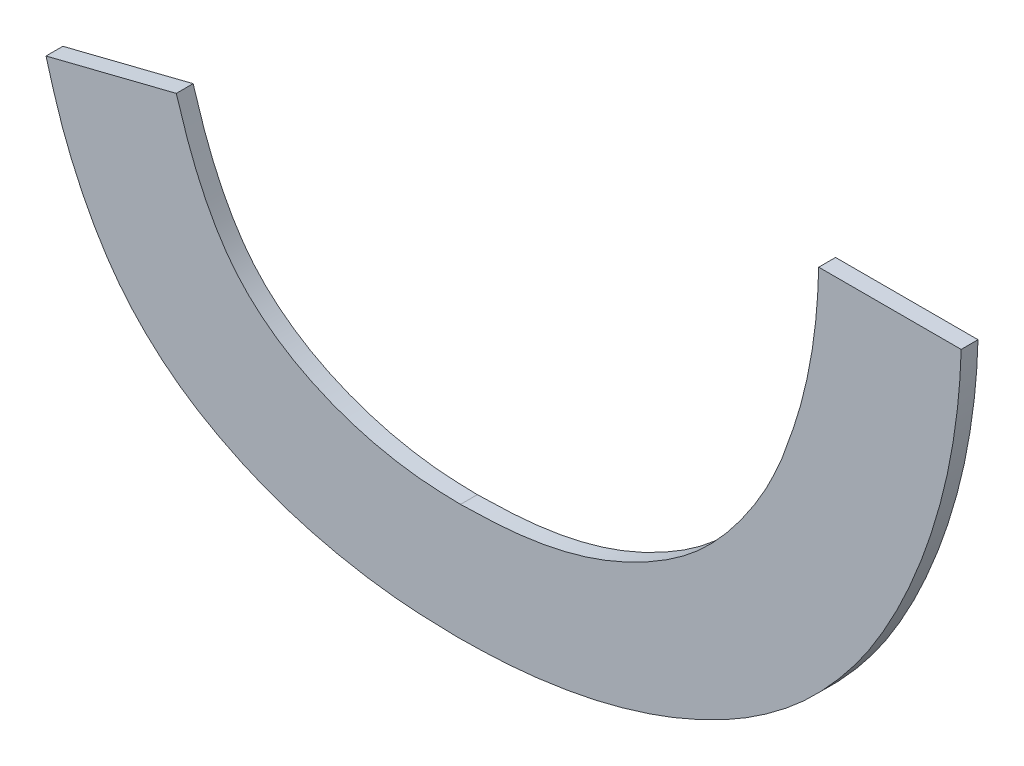
ISO-10303-21;
HEADER;
FILE_DESCRIPTION(('STEP AP214'),'2;1');
FILE_NAME('part.step','',(''),(''),'','','');
FILE_SCHEMA(('AUTOMOTIVE_DESIGN { 1 0 10303 214 1 1 1 1 }'));
ENDSEC;
DATA;
#1=APPLICATION_CONTEXT('core data for automotive mechanical design processes');
#2=APPLICATION_PROTOCOL_DEFINITION('international standard','automotive_design',2000,#1);
#3=PRODUCT_CONTEXT('',#1,'mechanical');
#4=PRODUCT('Part','Part','',(#3));
#5=PRODUCT_RELATED_PRODUCT_CATEGORY('part','',(#4));
#6=PRODUCT_DEFINITION_FORMATION('','',#4);
#7=PRODUCT_DEFINITION_CONTEXT('part definition',#1,'design');
#8=PRODUCT_DEFINITION('design','',#6,#7);
#9=PRODUCT_DEFINITION_SHAPE('','',#8);
#10=(LENGTH_UNIT() NAMED_UNIT(*) SI_UNIT(.MILLI.,.METRE.));
#11=(NAMED_UNIT(*) PLANE_ANGLE_UNIT() SI_UNIT($,.RADIAN.));
#12=(NAMED_UNIT(*) SI_UNIT($,.STERADIAN.) SOLID_ANGLE_UNIT());
#13=UNCERTAINTY_MEASURE_WITH_UNIT(LENGTH_MEASURE(1.E-05),#10,'distance_accuracy_value','');
#14=(GEOMETRIC_REPRESENTATION_CONTEXT(3) GLOBAL_UNCERTAINTY_ASSIGNED_CONTEXT((#13)) GLOBAL_UNIT_ASSIGNED_CONTEXT((#10,
#11,#12)) REPRESENTATION_CONTEXT('',''));
#15=CARTESIAN_POINT('',(0.,0.,0.));
#16=DIRECTION('',(0.,0.,1.));
#17=DIRECTION('',(1.,0.,0.));
#18=AXIS2_PLACEMENT_3D('',#15,#16,#17);
#19=CARTESIAN_POINT('',(-0.655048076924108,-11.9230769230769,0.5));
#20=CARTESIAN_POINT('',(-0.227942676023708,-11.912253221892,0.5));
#21=CARTESIAN_POINT('',(0.598985768411185,-11.8912972087745,0.5));
#22=CARTESIAN_POINT('',(1.79560321634429,-11.7428681340874,0.5));
#23=CARTESIAN_POINT('',(2.90208486743284,-11.4859858211931,0.5));
#24=CARTESIAN_POINT('',(3.91633813217372,-11.1241287640719,0.5));
#25=CARTESIAN_POINT('',(4.83588007622652,-10.6758590976377,0.5));
#26=CARTESIAN_POINT('',(5.67194288654616,-10.1735783047434,0.5));
#27=CARTESIAN_POINT('',(6.41263796404371,-9.60066620440625,0.5));
#28=CARTESIAN_POINT('',(7.05050920546266,-8.95610176625778,0.5));
#29=CARTESIAN_POINT('',(7.60994307134322,-8.26736469873984,0.5));
#30=CARTESIAN_POINT('',(8.10246708340465,-7.54470611909437,0.5));
#31=CARTESIAN_POINT('',(8.53640603782529,-6.79136395118303,0.5));
#32=CARTESIAN_POINT('',(8.76685496092209,-6.2623875938111,0.5));
#33=CARTESIAN_POINT('',(8.88221153846051,-5.99759615384615,0.5));
#34=B_SPLINE_CURVE_WITH_KNOTS('',3,(#19,#20,#21,#22,#23,#24,#25,#26,#27,#28,#29,#30,#31,#32,
#33),.UNSPECIFIED.,.F.,.F.,(4,1,1,1,1,1,1,1,1,1,1,1,4),(0.,0.106836014180273,0.206847627844255,
0.301052142516832,0.390450206998593,0.475620260337238,0.556580351208598,0.634067813729026,
0.709190584265669,0.782918087754289,0.855752867743289,0.927793737227064,1.),.UNSPECIFIED.);
#35=DIRECTION('',(0.,0.,1.));
#36=VECTOR('',#35,1.);
#37=SURFACE_OF_LINEAR_EXTRUSION('',#34,#36);
#38=CARTESIAN_POINT('',(-0.655048076924108,-11.9230769230769,1.));
#39=CARTESIAN_POINT('',(-0.227942676023708,-11.912253221892,1.));
#40=CARTESIAN_POINT('',(0.598985768411185,-11.8912972087745,1.));
#41=CARTESIAN_POINT('',(1.79560321634429,-11.7428681340874,1.));
#42=CARTESIAN_POINT('',(2.90208486743284,-11.4859858211931,1.));
#43=CARTESIAN_POINT('',(3.91633813217372,-11.1241287640719,1.));
#44=CARTESIAN_POINT('',(4.83588007622652,-10.6758590976377,1.));
#45=CARTESIAN_POINT('',(5.67194288654616,-10.1735783047434,1.));
#46=CARTESIAN_POINT('',(6.41263796404371,-9.60066620440625,1.));
#47=CARTESIAN_POINT('',(7.05050920546266,-8.95610176625778,1.));
#48=CARTESIAN_POINT('',(7.60994307134322,-8.26736469873984,1.));
#49=CARTESIAN_POINT('',(8.10246708340465,-7.54470611909437,1.));
#50=CARTESIAN_POINT('',(8.53640603782529,-6.79136395118303,1.));
#51=CARTESIAN_POINT('',(8.76685496092209,-6.2623875938111,1.));
#52=CARTESIAN_POINT('',(8.88221153846051,-5.99759615384615,1.));
#53=B_SPLINE_CURVE_WITH_KNOTS('',3,(#38,#39,#40,#41,#42,#43,#44,#45,#46,#47,#48,#49,#50,#51,
#52),.UNSPECIFIED.,.F.,.F.,(4,1,1,1,1,1,1,1,1,1,1,1,4),(0.,0.106836014180273,0.206847627844255,
0.301052142516832,0.390450206998593,0.475620260337238,0.556580351208598,0.634067813729026,
0.709190584265669,0.782918087754289,0.855752867743289,0.927793737227064,1.),.UNSPECIFIED.);
#54=CARTESIAN_POINT('',(-0.655048076924108,-11.9230769230769,1.));
#55=VERTEX_POINT('',#54);
#56=CARTESIAN_POINT('',(8.88221153846051,-5.99759615384615,1.));
#57=VERTEX_POINT('',#56);
#58=EDGE_CURVE('E87',#55,#57,#53,.T.);
#59=ORIENTED_EDGE('',*,*,#58,.T.);
#60=DIRECTION('',(0.,0.,1.));
#61=VECTOR('',#60,1.);
#62=CARTESIAN_POINT('',(8.88221153846051,-5.99759615384615,0.5));
#63=LINE('',#62,#61);
#64=CARTESIAN_POINT('',(8.88221153846051,-5.99759615384615,0.5));
#65=VERTEX_POINT('',#64);
#66=EDGE_CURVE('E177',#65,#57,#63,.T.);
#67=ORIENTED_EDGE('',*,*,#66,.F.);
#68=CARTESIAN_POINT('',(-0.655048076924108,-11.9230769230769,0.5));
#69=VERTEX_POINT('',#68);
#70=EDGE_CURVE('E63',#69,#65,#34,.T.);
#71=ORIENTED_EDGE('',*,*,#70,.F.);
#72=DIRECTION('',(0.,0.,1.));
#73=VECTOR('',#72,1.);
#74=CARTESIAN_POINT('',(-0.655048076924108,-11.9230769230769,0.5));
#75=LINE('',#74,#73);
#76=EDGE_CURVE('E121',#69,#55,#75,.T.);
#77=ORIENTED_EDGE('',*,*,#76,.T.);
#78=EDGE_LOOP('',(#59,#67,#71,#77));
#79=FACE_BOUND('',#78,.T.);
#80=ADVANCED_FACE('F39',(#79),#37,.F.);
#81=CARTESIAN_POINT('',(-9.09855769230872,-5.57091346153846,0.5));
#82=CARTESIAN_POINT('',(-8.98744101230085,-5.92721490390044,0.5));
#83=CARTESIAN_POINT('',(-8.77518048125361,-6.6078393912707,0.5));
#84=CARTESIAN_POINT('',(-8.3913070395867,-7.55641994943278,0.5));
#85=CARTESIAN_POINT('',(-7.96614306189073,-8.38541793645205,0.5));
#86=CARTESIAN_POINT('',(-7.49288630827849,-9.10846318948869,0.5));
#87=CARTESIAN_POINT('',(-6.93469335671508,-9.73466221352528,0.5));
#88=CARTESIAN_POINT('',(-6.28029615159374,-10.2803240013245,0.5));
#89=CARTESIAN_POINT('',(-5.52615107295613,-10.766113790124,0.5));
#90=CARTESIAN_POINT('',(-4.67479891142124,-11.1738680004581,0.5));
#91=CARTESIAN_POINT('',(-3.74774547887376,-11.5108745720782,0.5));
#92=CARTESIAN_POINT('',(-2.75985926458209,-11.7476719126669,0.5));
#93=CARTESIAN_POINT('',(-1.7233230579297,-11.8973046334385,0.5));
#94=CARTESIAN_POINT('',(-1.0161512438861,-11.9143652565362,0.5));
#95=CARTESIAN_POINT('',(-0.655048076924108,-11.9230769230769,0.5));
#96=B_SPLINE_CURVE_WITH_KNOTS('',3,(#81,#82,#83,#84,#85,#86,#87,#88,#89,#90,#91,#92,#93,#94,
#95),.UNSPECIFIED.,.F.,.F.,(4,1,1,1,1,1,1,1,1,1,1,1,4),(0.,0.0970539780290819,0.185397268126071,
0.265800241660235,0.339070664187919,0.40956103956954,0.483149451900637,0.560041506691692,
0.642305539556533,0.728180250965224,0.816140077428627,0.906115601612743,1.),.UNSPECIFIED.);
#97=DIRECTION('',(0.,0.,1.));
#98=VECTOR('',#97,1.);
#99=SURFACE_OF_LINEAR_EXTRUSION('',#96,#98);
#100=CARTESIAN_POINT('',(-9.09855769230872,-5.57091346153846,1.));
#101=CARTESIAN_POINT('',(-8.98744101230085,-5.92721490390044,1.));
#102=CARTESIAN_POINT('',(-8.77518048125361,-6.6078393912707,1.));
#103=CARTESIAN_POINT('',(-8.3913070395867,-7.55641994943278,1.));
#104=CARTESIAN_POINT('',(-7.96614306189073,-8.38541793645205,1.));
#105=CARTESIAN_POINT('',(-7.49288630827849,-9.10846318948869,1.));
#106=CARTESIAN_POINT('',(-6.93469335671508,-9.73466221352528,1.));
#107=CARTESIAN_POINT('',(-6.28029615159374,-10.2803240013245,1.));
#108=CARTESIAN_POINT('',(-5.52615107295613,-10.766113790124,1.));
#109=CARTESIAN_POINT('',(-4.67479891142124,-11.1738680004581,1.));
#110=CARTESIAN_POINT('',(-3.74774547887376,-11.5108745720782,1.));
#111=CARTESIAN_POINT('',(-2.75985926458209,-11.7476719126669,1.));
#112=CARTESIAN_POINT('',(-1.7233230579297,-11.8973046334385,1.));
#113=CARTESIAN_POINT('',(-1.0161512438861,-11.9143652565362,1.));
#114=CARTESIAN_POINT('',(-0.655048076924108,-11.9230769230769,1.));
#115=B_SPLINE_CURVE_WITH_KNOTS('',3,(#100,#101,#102,#103,#104,#105,#106,#107,#108,#109,#110,
#111,#112,#113,#114),.UNSPECIFIED.,.F.,.F.,(4,1,1,1,1,1,1,1,1,1,1,1,4),(0.,0.0970539780290819,
0.185397268126071,0.265800241660235,0.339070664187919,0.40956103956954,0.483149451900637,
0.560041506691692,0.642305539556533,0.728180250965224,0.816140077428627,0.906115601612743,1.),.UNSPECIFIED.);
#116=CARTESIAN_POINT('',(-9.09855769230872,-5.57091346153846,1.));
#117=VERTEX_POINT('',#116);
#118=EDGE_CURVE('E192',#117,#55,#115,.T.);
#119=ORIENTED_EDGE('',*,*,#118,.T.);
#120=ORIENTED_EDGE('',*,*,#76,.F.);
#121=CARTESIAN_POINT('',(-9.09855769230872,-5.57091346153846,0.5));
#122=VERTEX_POINT('',#121);
#123=EDGE_CURVE('E109',#122,#69,#96,.T.);
#124=ORIENTED_EDGE('',*,*,#123,.F.);
#125=DIRECTION('',(0.,0.,1.));
#126=VECTOR('',#125,1.);
#127=CARTESIAN_POINT('',(-9.09855769230872,-5.57091346153846,0.5));
#128=LINE('',#127,#126);
#129=EDGE_CURVE('E117',#122,#117,#128,.T.);
#130=ORIENTED_EDGE('',*,*,#129,.T.);
#131=EDGE_LOOP('',(#119,#120,#124,#130));
#132=FACE_BOUND('',#131,.T.);
#133=ADVANCED_FACE('F124',(#132),#99,.F.);
#134=CARTESIAN_POINT('',(-12.968750000001,-6.54447115384615,0.5));
#135=DIRECTION('',(0.243952665653616,-0.969787140005731,0.));
#136=DIRECTION('',(0.969787140005731,0.243952665653616,0.));
#137=AXIS2_PLACEMENT_3D('',#134,#135,#136);
#138=PLANE('',#137);
#139=DIRECTION('',(0.969787140005731,0.243952665653616,0.));
#140=VECTOR('',#139,1.);
#141=CARTESIAN_POINT('',(-12.968750000001,-6.54447115384615,1.));
#142=LINE('',#141,#140);
#143=CARTESIAN_POINT('',(-12.968750000001,-6.54447115384615,1.));
#144=VERTEX_POINT('',#143);
#145=EDGE_CURVE('E116',#144,#117,#142,.T.);
#146=ORIENTED_EDGE('',*,*,#145,.T.);
#147=ORIENTED_EDGE('',*,*,#129,.F.);
#148=DIRECTION('',(0.969787140005731,0.243952665653616,0.));
#149=VECTOR('',#148,1.);
#150=CARTESIAN_POINT('',(-12.968750000001,-6.54447115384615,0.5));
#151=LINE('',#150,#149);
#152=CARTESIAN_POINT('',(-12.968750000001,-6.54447115384615,0.5));
#153=VERTEX_POINT('',#152);
#154=EDGE_CURVE('E104',#153,#122,#151,.T.);
#155=ORIENTED_EDGE('',*,*,#154,.F.);
#156=DIRECTION('',(0.,0.,1.));
#157=VECTOR('',#156,1.);
#158=CARTESIAN_POINT('',(-12.968750000001,-6.54447115384615,0.5));
#159=LINE('',#158,#157);
#160=EDGE_CURVE('E122',#153,#144,#159,.T.);
#161=ORIENTED_EDGE('',*,*,#160,.T.);
#162=EDGE_LOOP('',(#146,#147,#155,#161));
#163=FACE_BOUND('',#162,.T.);
#164=ADVANCED_FACE('F119',(#163),#138,.F.);
#165=CARTESIAN_POINT('',(-0.733173076924106,-15.3846153846154,0.5));
#166=CARTESIAN_POINT('',(-1.26067625274901,-15.3725300728332,0.5));
#167=CARTESIAN_POINT('',(-2.29550287460362,-15.3488217750659,0.5));
#168=CARTESIAN_POINT('',(-3.80623043094523,-15.1450042682463,0.5));
#169=CARTESIAN_POINT('',(-5.24201812286606,-14.8225142352632,0.5));
#170=CARTESIAN_POINT('',(-6.58941721465151,-14.3710083027541,0.5));
#171=CARTESIAN_POINT('',(-7.82481036582091,-13.7946837668456,0.499999999999999));
#172=CARTESIAN_POINT('',(-8.93869762871373,-13.124498805989,0.5));
#173=CARTESIAN_POINT('',(-9.90320600541956,-12.3348536797799,0.5));
#174=CARTESIAN_POINT('',(-10.7381426032373,-11.4373758837522,0.5));
#175=CARTESIAN_POINT('',(-11.4395655318896,-10.4063695823777,0.5));
#176=CARTESIAN_POINT('',(-12.0462185256259,-9.24722003974045,0.5));
#177=CARTESIAN_POINT('',(-12.5723864402983,-7.95142071643278,0.5));
#178=CARTESIAN_POINT('',(-12.8336000795706,-7.02420526859636,0.5));
#179=CARTESIAN_POINT('',(-12.968750000001,-6.54447115384615,0.5));
#180=B_SPLINE_CURVE_WITH_KNOTS('',3,(#165,#166,#167,#168,#169,#170,#171,#172,#173,#174,#175,
#176,#177,#178,#179),.UNSPECIFIED.,.F.,.F.,(4,1,1,1,1,1,1,1,1,1,1,1,4),(0.,0.0958865091492192,
0.188104862476228,0.276649211064151,0.363159075085236,0.445946771508884,0.524101789397687,
0.598915408299288,0.671864768558401,0.746232765202449,0.824936792244247,0.909423647768157,1.),.UNSPECIFIED.);
#181=DIRECTION('',(0.,0.,1.));
#182=VECTOR('',#181,1.);
#183=SURFACE_OF_LINEAR_EXTRUSION('',#180,#182);
#184=CARTESIAN_POINT('',(-0.733173076924106,-15.3846153846154,1.));
#185=CARTESIAN_POINT('',(-1.26067625274901,-15.3725300728332,1.));
#186=CARTESIAN_POINT('',(-2.29550287460362,-15.3488217750659,1.));
#187=CARTESIAN_POINT('',(-3.80623043094523,-15.1450042682463,1.));
#188=CARTESIAN_POINT('',(-5.24201812286606,-14.8225142352632,1.));
#189=CARTESIAN_POINT('',(-6.58941721465151,-14.3710083027541,1.));
#190=CARTESIAN_POINT('',(-7.82481036582091,-13.7946837668456,0.999999999999999));
#191=CARTESIAN_POINT('',(-8.93869762871373,-13.124498805989,1.));
#192=CARTESIAN_POINT('',(-9.90320600541956,-12.3348536797799,1.));
#193=CARTESIAN_POINT('',(-10.7381426032373,-11.4373758837522,1.));
#194=CARTESIAN_POINT('',(-11.4395655318896,-10.4063695823777,1.));
#195=CARTESIAN_POINT('',(-12.0462185256259,-9.24722003974045,1.));
#196=CARTESIAN_POINT('',(-12.5723864402983,-7.95142071643278,1.));
#197=CARTESIAN_POINT('',(-12.8336000795706,-7.02420526859636,1.));
#198=CARTESIAN_POINT('',(-12.968750000001,-6.54447115384615,1.));
#199=B_SPLINE_CURVE_WITH_KNOTS('',3,(#184,#185,#186,#187,#188,#189,#190,#191,#192,#193,#194,
#195,#196,#197,#198),.UNSPECIFIED.,.F.,.F.,(4,1,1,1,1,1,1,1,1,1,1,1,4),(0.,0.0958865091492192,
0.188104862476228,0.276649211064151,0.363159075085236,0.445946771508884,0.524101789397687,
0.598915408299288,0.671864768558401,0.746232765202449,0.824936792244247,0.909423647768157,1.),.UNSPECIFIED.);
#200=CARTESIAN_POINT('',(-0.733173076924106,-15.3846153846154,1.));
#201=VERTEX_POINT('',#200);
#202=EDGE_CURVE('E176',#201,#144,#199,.T.);
#203=ORIENTED_EDGE('',*,*,#202,.T.);
#204=ORIENTED_EDGE('',*,*,#160,.F.);
#205=CARTESIAN_POINT('',(-0.733173076924106,-15.3846153846154,0.5));
#206=VERTEX_POINT('',#205);
#207=EDGE_CURVE('E108',#206,#153,#180,.T.);
#208=ORIENTED_EDGE('',*,*,#207,.F.);
#209=DIRECTION('',(0.,0.,1.));
#210=VECTOR('',#209,1.);
#211=CARTESIAN_POINT('',(-0.733173076924106,-15.3846153846154,0.5));
#212=LINE('',#211,#210);
#213=EDGE_CURVE('E42',#206,#201,#212,.T.);
#214=ORIENTED_EDGE('',*,*,#213,.T.);
#215=EDGE_LOOP('',(#203,#204,#208,#214));
#216=FACE_BOUND('',#215,.T.);
#217=ADVANCED_FACE('F147',(#216),#183,.F.);
#218=CARTESIAN_POINT('',(-7.66146588641114,14.1280419590805,0.5));
#219=DIRECTION('',(0.,0.,1.));
#220=DIRECTION('',(0.,-1.,0.));
#221=AXIS2_PLACEMENT_3D('',#218,#219,#220);
#222=PLANE('',#221);
#223=CARTESIAN_POINT('',(8.88221153846051,-5.99759615384615,0.5));
#224=CARTESIAN_POINT('',(9.05395139361114,-5.5318405713625,0.5));
#225=CARTESIAN_POINT('',(9.40046975472602,-4.59208863678219,0.5));
#226=CARTESIAN_POINT('',(9.74909232894622,-3.11693190748672,0.5));
#227=CARTESIAN_POINT('',(9.95734073492728,-1.58253981141094,0.5));
#228=CARTESIAN_POINT('',(9.98561700262145,-0.541535933758853,0.5));
#229=CARTESIAN_POINT('',(9.99999999999897,-0.0120192307692304,0.5));
#230=B_SPLINE_CURVE_WITH_KNOTS('',3,(#223,#224,#225,#226,#227,#228,#229),.UNSPECIFIED.,.F.,.F.,
(4,1,1,1,4),(0.,0.242964195204858,0.490227237341868,0.7406991478596,1.),.UNSPECIFIED.);
#231=CARTESIAN_POINT('',(9.98590368424584,-0.5,0.499999999999972));
#232=VERTEX_POINT('',#231);
#233=EDGE_CURVE('E130',#65,#232,#230,.T.);
#234=ORIENTED_EDGE('',*,*,#233,.T.);
#235=DIRECTION('',(1.,0.,0.));
#236=VECTOR('',#235,1.);
#237=CARTESIAN_POINT('',(-7.66146588641114,-0.5,0.499999999999986));
#238=LINE('',#237,#236);
#239=CARTESIAN_POINT('',(14.217121000156,-0.499999990276964,0.5));
#240=VERTEX_POINT('',#239);
#241=EDGE_CURVE('E166',#232,#240,#238,.T.);
#242=ORIENTED_EDGE('',*,*,#241,.T.);
#243=CARTESIAN_POINT('',(14.2307692307682,0.14423076923077,0.5));
#244=CARTESIAN_POINT('',(14.2245215600668,-0.214491330148989,0.5));
#245=CARTESIAN_POINT('',(14.212113926833,-0.926899594711211,0.5));
#246=CARTESIAN_POINT('',(14.1269680460242,-1.98855112536666,0.5));
#247=CARTESIAN_POINT('',(13.9820061282668,-3.03139107219399,0.5));
#248=CARTESIAN_POINT('',(13.7853258769673,-4.05755226425519,0.5));
#249=CARTESIAN_POINT('',(13.5242976350639,-5.0617602231579,0.5));
#250=CARTESIAN_POINT('',(13.2123005750221,-6.05187499228799,0.5));
#251=CARTESIAN_POINT('',(12.8391304925806,-7.02226277182851,0.5));
#252=CARTESIAN_POINT('',(12.4165293079413,-7.96972197398081,0.5));
#253=CARTESIAN_POINT('',(11.9359898417133,-8.87469002784141,0.5));
#254=CARTESIAN_POINT('',(11.4110467141556,-9.73106519259955,0.5));
#255=CARTESIAN_POINT('',(10.8244202381889,-10.5203205302535,0.5));
#256=CARTESIAN_POINT('',(10.1899608143868,-11.2498530365224,0.5));
#257=CARTESIAN_POINT('',(9.51274073199563,-11.9276180074818,0.5));
#258=CARTESIAN_POINT('',(8.77484472252129,-12.5341283950603,0.5));
#259=CARTESIAN_POINT('',(7.99160026075173,-13.083285483245,0.5));
#260=CARTESIAN_POINT('',(7.16074745061875,-13.570094881584,0.5));
#261=CARTESIAN_POINT('',(6.2868704074046,-13.9948895882972,0.5));
#262=CARTESIAN_POINT('',(5.38047938979651,-14.3690215515165,0.5));
#263=CARTESIAN_POINT('',(4.43949491407399,-14.6794780072065,0.5));
#264=CARTESIAN_POINT('',(3.46931647587832,-14.9414052152154,0.5));
#265=CARTESIAN_POINT('',(2.4645665556392,-15.1360210110178,0.5));
#266=CARTESIAN_POINT('',(1.4278354130858,-15.2824195270919,0.5));
#267=CARTESIAN_POINT('',(0.357951507380371,-15.3660380087855,0.5));
#268=CARTESIAN_POINT('',(-0.36644765061139,-15.378371554929,0.5));
#269=CARTESIAN_POINT('',(-0.733173076924106,-15.3846153846154,0.5));
#270=B_SPLINE_CURVE_WITH_KNOTS('',3,(#243,#244,#245,#246,#247,#248,#249,#250,#251,#252,#253,
#254,#255,#256,#257,#258,#259,#260,#261,#262,#263,#264,#265,#266,#267,#268,#269),.UNSPECIFIED.,
.F.,.F.,(4,1,1,1,1,1,1,1,1,1,1,1,1,1,1,1,1,1,1,1,1,1,1,1,4),(0.,0.0441686440671714,
0.0877172249001831,0.131041702453182,0.173755940637081,0.216291049778394,0.258727351489785,
0.301512035926708,0.344237667232721,0.386386983602717,0.427592563465312,0.467798247020072,
0.507314046039588,0.546557161893323,0.585623142094295,0.624763803435941,0.664232616215431,
0.704055148076328,0.744317536586474,0.784877262970014,0.825980839518649,0.867968906079362,
0.910804751387539,0.954845108236797,1.),.UNSPECIFIED.);
#271=EDGE_CURVE('E96',#240,#206,#270,.T.);
#272=ORIENTED_EDGE('',*,*,#271,.T.);
#273=ORIENTED_EDGE('',*,*,#207,.T.);
#274=ORIENTED_EDGE('',*,*,#154,.T.);
#275=ORIENTED_EDGE('',*,*,#123,.T.);
#276=ORIENTED_EDGE('',*,*,#70,.T.);
#277=EDGE_LOOP('',(#234,#242,#272,#273,#274,#275,#276));
#278=FACE_BOUND('',#277,.T.);
#279=ADVANCED_FACE('F103',(#278),#222,.F.);
#280=DIRECTION('',(0.,0.,1.));
#281=VECTOR('',#280,1.);
#282=SURFACE_OF_LINEAR_EXTRUSION('',#230,#281);
#283=CARTESIAN_POINT('',(8.88221153846051,-5.99759615384615,1.));
#284=CARTESIAN_POINT('',(9.05395139361114,-5.5318405713625,1.));
#285=CARTESIAN_POINT('',(9.40046975472602,-4.59208863678219,1.));
#286=CARTESIAN_POINT('',(9.74909232894622,-3.11693190748672,1.));
#287=CARTESIAN_POINT('',(9.95734073492728,-1.58253981141094,1.));
#288=CARTESIAN_POINT('',(9.98561700262145,-0.541535933758853,1.));
#289=CARTESIAN_POINT('',(9.99999999999897,-0.0120192307692304,1.));
#290=B_SPLINE_CURVE_WITH_KNOTS('',3,(#283,#284,#285,#286,#287,#288,#289),.UNSPECIFIED.,.F.,.F.,
(4,1,1,1,4),(0.,0.242964195204858,0.490227237341868,0.7406991478596,1.),.UNSPECIFIED.);
#291=CARTESIAN_POINT('',(9.98590368424584,-0.5,1.));
#292=VERTEX_POINT('',#291);
#293=EDGE_CURVE('E159',#57,#292,#290,.T.);
#294=ORIENTED_EDGE('',*,*,#293,.T.);
#295=DIRECTION('',(0.,0.,1.));
#296=VECTOR('',#295,1.);
#297=CARTESIAN_POINT('',(9.98590368393164,-0.5,0.5));
#298=LINE('',#297,#296);
#299=EDGE_CURVE('E163',#292,#232,#298,.F.);
#300=ORIENTED_EDGE('',*,*,#299,.T.);
#301=ORIENTED_EDGE('',*,*,#233,.F.);
#302=ORIENTED_EDGE('',*,*,#66,.T.);
#303=EDGE_LOOP('',(#294,#300,#301,#302));
#304=FACE_BOUND('',#303,.T.);
#305=ADVANCED_FACE('F219',(#304),#282,.F.);
#306=DIRECTION('',(0.,0.,1.));
#307=VECTOR('',#306,1.);
#308=SURFACE_OF_LINEAR_EXTRUSION('',#270,#307);
#309=ORIENTED_EDGE('',*,*,#271,.F.);
#310=DIRECTION('',(0.,0.,1.));
#311=VECTOR('',#310,1.);
#312=CARTESIAN_POINT('',(14.2171209998767,-0.5,0.5));
#313=LINE('',#312,#311);
#314=CARTESIAN_POINT('',(14.217121000156,-0.5,1.));
#315=VERTEX_POINT('',#314);
#316=EDGE_CURVE('E57',#240,#315,#313,.T.);
#317=ORIENTED_EDGE('',*,*,#316,.T.);
#318=CARTESIAN_POINT('',(14.2307692307682,0.14423076923077,1.));
#319=CARTESIAN_POINT('',(14.2245215600668,-0.214491330148989,1.));
#320=CARTESIAN_POINT('',(14.212113926833,-0.926899594711211,1.));
#321=CARTESIAN_POINT('',(14.1269680460242,-1.98855112536666,1.));
#322=CARTESIAN_POINT('',(13.9820061282668,-3.03139107219399,1.));
#323=CARTESIAN_POINT('',(13.7853258769673,-4.05755226425519,1.));
#324=CARTESIAN_POINT('',(13.5242976350639,-5.0617602231579,1.));
#325=CARTESIAN_POINT('',(13.2123005750221,-6.05187499228799,1.));
#326=CARTESIAN_POINT('',(12.8391304925806,-7.02226277182851,1.));
#327=CARTESIAN_POINT('',(12.4165293079413,-7.96972197398081,1.));
#328=CARTESIAN_POINT('',(11.9359898417133,-8.87469002784141,1.));
#329=CARTESIAN_POINT('',(11.4110467141556,-9.73106519259955,1.));
#330=CARTESIAN_POINT('',(10.8244202381889,-10.5203205302535,1.));
#331=CARTESIAN_POINT('',(10.1899608143868,-11.2498530365224,1.));
#332=CARTESIAN_POINT('',(9.51274073199563,-11.9276180074818,1.));
#333=CARTESIAN_POINT('',(8.77484472252129,-12.5341283950603,1.));
#334=CARTESIAN_POINT('',(7.99160026075173,-13.083285483245,1.));
#335=CARTESIAN_POINT('',(7.16074745061875,-13.570094881584,1.));
#336=CARTESIAN_POINT('',(6.2868704074046,-13.9948895882972,1.));
#337=CARTESIAN_POINT('',(5.38047938979651,-14.3690215515165,1.));
#338=CARTESIAN_POINT('',(4.43949491407399,-14.6794780072065,1.));
#339=CARTESIAN_POINT('',(3.46931647587832,-14.9414052152154,1.));
#340=CARTESIAN_POINT('',(2.4645665556392,-15.1360210110178,1.));
#341=CARTESIAN_POINT('',(1.4278354130858,-15.2824195270919,1.));
#342=CARTESIAN_POINT('',(0.357951507380371,-15.3660380087855,1.));
#343=CARTESIAN_POINT('',(-0.36644765061139,-15.378371554929,1.));
#344=CARTESIAN_POINT('',(-0.733173076924106,-15.3846153846154,1.));
#345=B_SPLINE_CURVE_WITH_KNOTS('',3,(#318,#319,#320,#321,#322,#323,#324,#325,#326,#327,#328,
#329,#330,#331,#332,#333,#334,#335,#336,#337,#338,#339,#340,#341,#342,#343,#344),.UNSPECIFIED.,
.F.,.F.,(4,1,1,1,1,1,1,1,1,1,1,1,1,1,1,1,1,1,1,1,1,1,1,1,4),(0.,0.0441686440671714,
0.0877172249001831,0.131041702453182,0.173755940637081,0.216291049778394,0.258727351489785,
0.301512035926708,0.344237667232721,0.386386983602717,0.427592563465312,0.467798247020072,
0.507314046039588,0.546557161893323,0.585623142094295,0.624763803435941,0.664232616215431,
0.704055148076328,0.744317536586474,0.784877262970014,0.825980839518649,0.867968906079362,
0.910804751387539,0.954845108236797,1.),.UNSPECIFIED.);
#346=EDGE_CURVE('E161',#315,#201,#345,.T.);
#347=ORIENTED_EDGE('',*,*,#346,.T.);
#348=ORIENTED_EDGE('',*,*,#213,.F.);
#349=EDGE_LOOP('',(#309,#317,#347,#348));
#350=FACE_BOUND('',#349,.T.);
#351=ADVANCED_FACE('F41',(#350),#308,.F.);
#352=CARTESIAN_POINT('',(-7.66146588641114,14.1280419590805,1.));
#353=DIRECTION('',(0.,0.,1.));
#354=DIRECTION('',(0.,-1.,0.));
#355=AXIS2_PLACEMENT_3D('',#352,#353,#354);
#356=PLANE('',#355);
#357=ORIENTED_EDGE('',*,*,#346,.F.);
#358=DIRECTION('',(-1.,0.,0.));
#359=VECTOR('',#358,1.);
#360=CARTESIAN_POINT('',(-17.,-0.5,1.));
#361=LINE('',#360,#359);
#362=EDGE_CURVE('E11',#315,#292,#361,.T.);
#363=ORIENTED_EDGE('',*,*,#362,.T.);
#364=ORIENTED_EDGE('',*,*,#293,.F.);
#365=ORIENTED_EDGE('',*,*,#58,.F.);
#366=ORIENTED_EDGE('',*,*,#118,.F.);
#367=ORIENTED_EDGE('',*,*,#145,.F.);
#368=ORIENTED_EDGE('',*,*,#202,.F.);
#369=EDGE_LOOP('',(#357,#363,#364,#365,#366,#367,#368));
#370=FACE_BOUND('',#369,.T.);
#371=ADVANCED_FACE('F223',(#370),#356,.T.);
#372=CARTESIAN_POINT('',(-17.,-0.5,1.));
#373=DIRECTION('',(0.,-1.,0.));
#374=DIRECTION('',(0.,0.,-1.));
#375=AXIS2_PLACEMENT_3D('',#372,#373,#374);
#376=PLANE('',#375);
#377=ORIENTED_EDGE('',*,*,#241,.F.);
#378=ORIENTED_EDGE('',*,*,#299,.F.);
#379=ORIENTED_EDGE('',*,*,#362,.F.);
#380=ORIENTED_EDGE('',*,*,#316,.F.);
#381=EDGE_LOOP('',(#377,#378,#379,#380));
#382=FACE_BOUND('',#381,.T.);
#383=ADVANCED_FACE('F226',(#382),#376,.F.);
#384=CLOSED_SHELL('',(#80,#133,#164,#217,#279,#305,#351,#371,#383));
#385=MANIFOLD_SOLID_BREP('B2',#384);
#386=ADVANCED_BREP_SHAPE_REPRESENTATION('',(#18,#385),#14);
#387=SHAPE_DEFINITION_REPRESENTATION(#9,#386);
ENDSEC;
END-ISO-10303-21;
